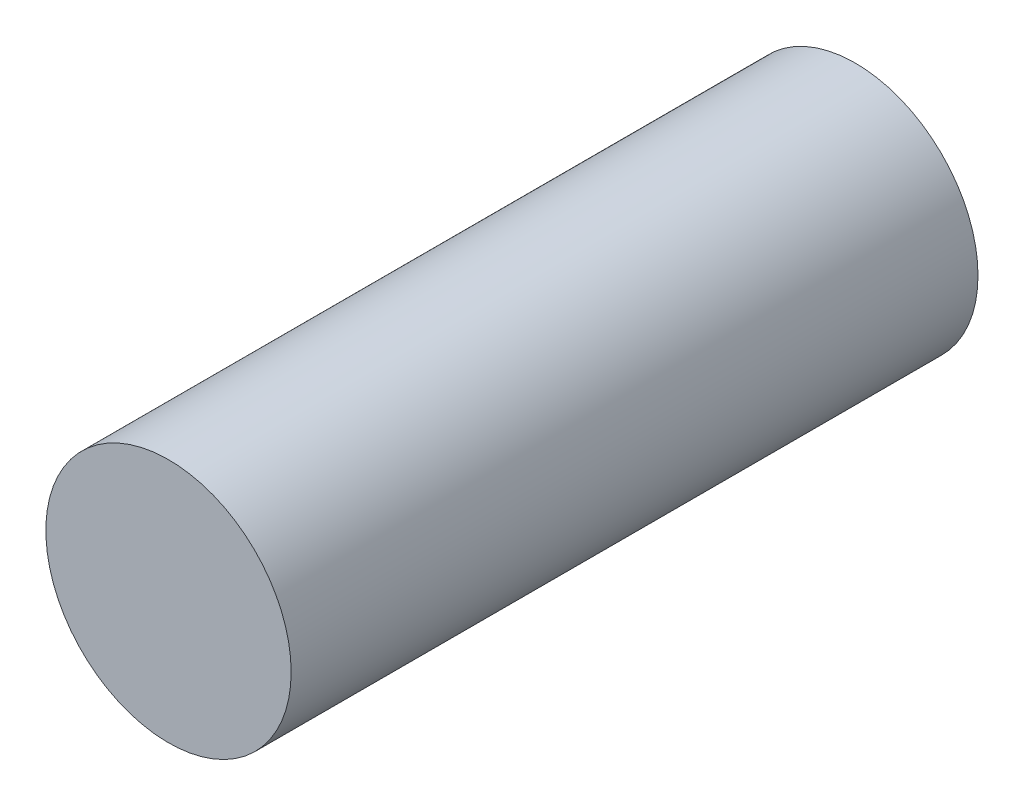
ISO-10303-21;
HEADER;
FILE_DESCRIPTION(('STEP AP214'),'2;1');
FILE_NAME('part.step','',(''),(''),'','','');
FILE_SCHEMA(('AUTOMOTIVE_DESIGN { 1 0 10303 214 1 1 1 1 }'));
ENDSEC;
DATA;
#1=APPLICATION_CONTEXT('core data for automotive mechanical design processes');
#2=APPLICATION_PROTOCOL_DEFINITION('international standard','automotive_design',2000,#1);
#3=PRODUCT_CONTEXT('',#1,'mechanical');
#4=PRODUCT('Part','Part','',(#3));
#5=PRODUCT_RELATED_PRODUCT_CATEGORY('part','',(#4));
#6=PRODUCT_DEFINITION_FORMATION('','',#4);
#7=PRODUCT_DEFINITION_CONTEXT('part definition',#1,'design');
#8=PRODUCT_DEFINITION('design','',#6,#7);
#9=PRODUCT_DEFINITION_SHAPE('','',#8);
#10=(LENGTH_UNIT() NAMED_UNIT(*) SI_UNIT(.MILLI.,.METRE.));
#11=(NAMED_UNIT(*) PLANE_ANGLE_UNIT() SI_UNIT($,.RADIAN.));
#12=(NAMED_UNIT(*) SI_UNIT($,.STERADIAN.) SOLID_ANGLE_UNIT());
#13=UNCERTAINTY_MEASURE_WITH_UNIT(LENGTH_MEASURE(1.E-05),#10,'distance_accuracy_value','');
#14=(GEOMETRIC_REPRESENTATION_CONTEXT(3) GLOBAL_UNCERTAINTY_ASSIGNED_CONTEXT((#13)) GLOBAL_UNIT_ASSIGNED_CONTEXT((#10,
#11,#12)) REPRESENTATION_CONTEXT('',''));
#15=CARTESIAN_POINT('',(0.,0.,0.));
#16=DIRECTION('',(0.,0.,1.));
#17=DIRECTION('',(1.,0.,0.));
#18=AXIS2_PLACEMENT_3D('',#15,#16,#17);
#19=CARTESIAN_POINT('',(0.,0.,70.));
#20=DIRECTION('',(0.,0.,-1.));
#21=DIRECTION('',(-1.,0.,0.));
#22=AXIS2_PLACEMENT_3D('',#19,#20,#21);
#23=CYLINDRICAL_SURFACE('',#22,12.5);
#24=CARTESIAN_POINT('',(0.,0.,70.));
#25=DIRECTION('',(0.,0.,1.));
#26=DIRECTION('',(1.,0.,0.));
#27=AXIS2_PLACEMENT_3D('',#24,#25,#26);
#28=CIRCLE('',#27,12.5);
#29=CARTESIAN_POINT('',(12.5,0.,70.));
#30=VERTEX_POINT('',#29);
#31=EDGE_CURVE('E10',#30,#30,#28,.T.);
#32=ORIENTED_EDGE('',*,*,#31,.F.);
#33=EDGE_LOOP('',(#32));
#34=FACE_BOUND('',#33,.T.);
#35=CARTESIAN_POINT('',(0.,0.,0.));
#36=DIRECTION('',(0.,0.,1.));
#37=DIRECTION('',(1.,0.,0.));
#38=AXIS2_PLACEMENT_3D('',#35,#36,#37);
#39=CIRCLE('',#38,12.5);
#40=CARTESIAN_POINT('',(12.5,0.,0.));
#41=VERTEX_POINT('',#40);
#42=EDGE_CURVE('E34',#41,#41,#39,.T.);
#43=ORIENTED_EDGE('',*,*,#42,.T.);
#44=EDGE_LOOP('',(#43));
#45=FACE_BOUND('',#44,.T.);
#46=ADVANCED_FACE('F31',(#34,#45),#23,.T.);
#47=CARTESIAN_POINT('',(0.,0.,70.));
#48=DIRECTION('',(0.,0.,1.));
#49=DIRECTION('',(1.,0.,0.));
#50=AXIS2_PLACEMENT_3D('',#47,#48,#49);
#51=PLANE('',#50);
#52=ORIENTED_EDGE('',*,*,#31,.T.);
#53=EDGE_LOOP('',(#52));
#54=FACE_BOUND('',#53,.T.);
#55=ADVANCED_FACE('F46',(#54),#51,.T.);
#56=CARTESIAN_POINT('',(0.,0.,0.));
#57=DIRECTION('',(0.,0.,1.));
#58=DIRECTION('',(1.,0.,0.));
#59=AXIS2_PLACEMENT_3D('',#56,#57,#58);
#60=PLANE('',#59);
#61=ORIENTED_EDGE('',*,*,#42,.F.);
#62=EDGE_LOOP('',(#61));
#63=FACE_BOUND('',#62,.T.);
#64=ADVANCED_FACE('F44',(#63),#60,.F.);
#65=CLOSED_SHELL('',(#46,#55,#64));
#66=MANIFOLD_SOLID_BREP('B2',#65);
#67=ADVANCED_BREP_SHAPE_REPRESENTATION('',(#18,#66),#14);
#68=SHAPE_DEFINITION_REPRESENTATION(#9,#67);
ENDSEC;
END-ISO-10303-21;
